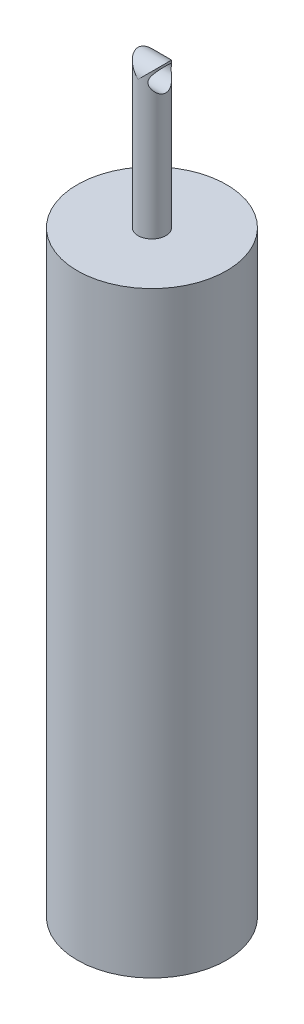
ISO-10303-21;
HEADER;
FILE_DESCRIPTION(('STEP AP214'),'2;1');
FILE_NAME('part.step','',(''),(''),'','','');
FILE_SCHEMA(('AUTOMOTIVE_DESIGN { 1 0 10303 214 1 1 1 1 }'));
ENDSEC;
DATA;
#1=APPLICATION_CONTEXT('core data for automotive mechanical design processes');
#2=APPLICATION_PROTOCOL_DEFINITION('international standard','automotive_design',2000,#1);
#3=PRODUCT_CONTEXT('',#1,'mechanical');
#4=PRODUCT('Part','Part','',(#3));
#5=PRODUCT_RELATED_PRODUCT_CATEGORY('part','',(#4));
#6=PRODUCT_DEFINITION_FORMATION('','',#4);
#7=PRODUCT_DEFINITION_CONTEXT('part definition',#1,'design');
#8=PRODUCT_DEFINITION('design','',#6,#7);
#9=PRODUCT_DEFINITION_SHAPE('','',#8);
#10=(LENGTH_UNIT() NAMED_UNIT(*) SI_UNIT(.MILLI.,.METRE.));
#11=(NAMED_UNIT(*) PLANE_ANGLE_UNIT() SI_UNIT($,.RADIAN.));
#12=(NAMED_UNIT(*) SI_UNIT($,.STERADIAN.) SOLID_ANGLE_UNIT());
#13=UNCERTAINTY_MEASURE_WITH_UNIT(LENGTH_MEASURE(1.E-05),#10,'distance_accuracy_value','');
#14=(GEOMETRIC_REPRESENTATION_CONTEXT(3) GLOBAL_UNCERTAINTY_ASSIGNED_CONTEXT((#13)) GLOBAL_UNIT_ASSIGNED_CONTEXT((#10,
#11,#12)) REPRESENTATION_CONTEXT('',''));
#15=CARTESIAN_POINT('',(0.,0.,0.));
#16=DIRECTION('',(0.,0.,1.));
#17=DIRECTION('',(1.,0.,0.));
#18=AXIS2_PLACEMENT_3D('',#15,#16,#17);
#19=CARTESIAN_POINT('',(0.,254.,0.));
#20=DIRECTION('',(0.,-1.,0.));
#21=DIRECTION('',(0.,0.,-1.));
#22=AXIS2_PLACEMENT_3D('',#19,#20,#21);
#23=CYLINDRICAL_SURFACE('',#22,4.73075);
#24=CARTESIAN_POINT('',(-2.57468813645456,249.26925,-3.96875000000002));
#25=CARTESIAN_POINT('',(-2.57468971332988,249.338601991821,-3.96874942252867));
#26=CARTESIAN_POINT('',(-2.57750730844369,249.407970058366,-3.96692601158753));
#27=CARTESIAN_POINT('',(-2.58861018303855,249.546094547328,-3.95968816621984));
#28=CARTESIAN_POINT('',(-2.59689877167569,249.614850574026,-3.95427155842138));
#29=CARTESIAN_POINT('',(-2.62942371788314,249.819668547789,-3.93278997364381));
#30=CARTESIAN_POINT('',(-2.66131672407075,249.954010545549,-3.91149402252363));
#31=CARTESIAN_POINT('',(-2.75570115172025,250.266925791372,-3.84583712088784));
#32=CARTESIAN_POINT('',(-2.82530243131442,250.442014362949,-3.79568866945637));
#33=CARTESIAN_POINT('',(-2.98035012531049,250.777814814886,-3.67521360901825));
#34=CARTESIAN_POINT('',(-3.06584919847753,250.938476205615,-3.60481950319501));
#35=CARTESIAN_POINT('',(-3.21978521105146,251.204790217722,-3.46708048205793));
#36=CARTESIAN_POINT('',(-3.28663430019577,251.313624601264,-3.40399800638961));
#37=CARTESIAN_POINT('',(-3.42167551477278,251.524334036358,-3.268225138155));
#38=CARTESIAN_POINT('',(-3.48986822354122,251.62620597538,-3.19553049057661));
#39=CARTESIAN_POINT('',(-3.62554279322456,251.8227927752,-3.0407270661403));
#40=CARTESIAN_POINT('',(-3.69302540682989,251.917516050907,-2.95862965362111));
#41=CARTESIAN_POINT('',(-3.82569960997007,252.099592337657,-2.78495427775517));
#42=CARTESIAN_POINT('',(-3.89089095391635,252.186944560034,-2.69337530225777));
#43=CARTESIAN_POINT('',(-4.05349649647098,252.401199638881,-2.44578610524942));
#44=CARTESIAN_POINT('',(-4.14812701200517,252.522308344019,-2.28277565363191));
#45=CARTESIAN_POINT('',(-4.32164710374794,252.740847607605,-1.93420300412105));
#46=CARTESIAN_POINT('',(-4.40056226908315,252.838316715487,-1.74867827217238));
#47=CARTESIAN_POINT('',(-4.52458749478744,252.990059629473,-1.3918615367656));
#48=CARTESIAN_POINT('',(-4.57319506489267,253.04890526409,-1.22374738539483));
#49=CARTESIAN_POINT('',(-4.65211877327305,253.144027399935,-0.877101709358009));
#50=CARTESIAN_POINT('',(-4.68244552296855,253.18031699459,-0.698576294229406));
#51=CARTESIAN_POINT('',(-4.72241952763671,253.228088382441,-0.335104521582716));
#52=CARTESIAN_POINT('',(-4.73197750858056,253.23946308126,-0.150133903620591));
#53=CARTESIAN_POINT('',(-4.7292688074294,253.236234525711,0.219418813555285));
#54=CARTESIAN_POINT('',(-4.71700302474351,253.221632341911,0.404000928466296));
#55=CARTESIAN_POINT('',(-4.67335567862697,253.169431742792,0.754143049894994));
#56=CARTESIAN_POINT('',(-4.64335965621403,253.133499390267,0.920134230873132));
#57=CARTESIAN_POINT('',(-4.56759452754371,253.042120549594,1.24280480698384));
#58=CARTESIAN_POINT('',(-4.52182308957217,252.986671176671,1.39948282155069));
#59=CARTESIAN_POINT('',(-4.41288381129009,252.85339860655,1.71358251663824));
#60=CARTESIAN_POINT('',(-4.34858225732612,252.774093473863,1.86997325887046));
#61=CARTESIAN_POINT('',(-4.2083268142693,252.598484143054,2.16726458994668));
#62=CARTESIAN_POINT('',(-4.13236290272484,252.502165312798,2.30815167468178));
#63=CARTESIAN_POINT('',(-3.99308695696241,252.321806235257,2.53938733554131));
#64=CARTESIAN_POINT('',(-3.9315645815349,252.24100578847,2.6333990241937));
#65=CARTESIAN_POINT('',(-3.80552439042022,252.072134439307,2.81246513959544));
#66=CARTESIAN_POINT('',(-3.74100645082973,251.98406323608,2.89751919536039));
#67=CARTESIAN_POINT('',(-3.61032330340906,251.800956866428,3.05881635104315));
#68=CARTESIAN_POINT('',(-3.54415513342796,251.705908477425,3.13504197691417));
#69=CARTESIAN_POINT('',(-3.41191367327333,251.509216077582,3.2784663472193));
#70=CARTESIAN_POINT('',(-3.34584035808783,251.407574374489,3.34566822507068));
#71=CARTESIAN_POINT('',(-3.23231050629412,251.224388926984,3.45495234870609));
#72=CARTESIAN_POINT('',(-3.18440415243179,251.144331651843,3.49906966478655));
#73=CARTESIAN_POINT('',(-3.09070679702214,250.980383821661,3.58210007111592));
#74=CARTESIAN_POINT('',(-3.04491528949593,250.89649419317,3.62101441044818));
#75=CARTESIAN_POINT('',(-2.95676420764234,250.724874733139,3.69334307909613));
#76=CARTESIAN_POINT('',(-2.91439732260263,250.637153732741,3.72676929054645));
#77=CARTESIAN_POINT('',(-2.83456369118886,250.457608525781,3.78784510516929));
#78=CARTESIAN_POINT('',(-2.79709443202994,250.365786456026,3.81549767496191));
#79=CARTESIAN_POINT('',(-2.71816820067166,250.148264583032,3.87228713877423));
#80=CARTESIAN_POINT('',(-2.67918460623703,250.021018552802,3.89913832994347));
#81=CARTESIAN_POINT('',(-2.61814368106643,249.760707713928,3.94039577931789));
#82=CARTESIAN_POINT('',(-2.59604535032594,249.627657834519,3.95483219327597));
#83=CARTESIAN_POINT('',(-2.57268925163198,249.357766157556,3.97007572412585));
#84=CARTESIAN_POINT('',(-2.5715977075302,249.220902691219,3.97077413502207));
#85=CARTESIAN_POINT('',(-2.59093195265003,248.949308380201,3.95817722511463));
#86=CARTESIAN_POINT('',(-2.61138555676878,248.814580520795,3.94486381499715));
#87=CARTESIAN_POINT('',(-2.6767509535227,248.520062808166,3.90087649847682));
#88=CARTESIAN_POINT('',(-2.72629147281271,248.361851154493,3.86685017734675));
#89=CARTESIAN_POINT('',(-2.84251097363808,248.056392736104,3.78222958950236));
#90=CARTESIAN_POINT('',(-2.90924742108079,247.909184914587,3.73157961086452));
#91=CARTESIAN_POINT('',(-3.03766701431327,247.654359084599,3.62739565117228));
#92=CARTESIAN_POINT('',(-3.09764529607708,247.544752887175,3.57651364227212));
#93=CARTESIAN_POINT('',(-3.22093516159029,247.332001218929,3.46589526925913));
#94=CARTESIAN_POINT('',(-3.2842485486437,247.228859310761,3.40615408260165));
#95=CARTESIAN_POINT('',(-3.41217318588725,247.028754329536,3.27800018224335));
#96=CARTESIAN_POINT('',(-3.47678593622256,246.931799010015,3.2095768962282));
#97=CARTESIAN_POINT('',(-3.60556613667967,246.744228893895,3.06419958740264));
#98=CARTESIAN_POINT('',(-3.66973367370176,246.653612826689,2.98724728214442));
#99=CARTESIAN_POINT('',(-3.79813673076094,246.476281479666,2.82230552576996));
#100=CARTESIAN_POINT('',(-3.86231421417695,246.389770493945,2.73405033897706));
#101=CARTESIAN_POINT('',(-3.98722410662841,246.224273763369,2.54844248198927));
#102=CARTESIAN_POINT('',(-4.047955867987,246.145289431381,2.45108811050593));
#103=CARTESIAN_POINT('',(-4.16434188249129,245.995886255273,2.24765087824644));
#104=CARTESIAN_POINT('',(-4.22000974949865,245.925444264814,2.14159297199866));
#105=CARTESIAN_POINT('',(-4.3249265080885,245.793975177598,1.92092429908769));
#106=CARTESIAN_POINT('',(-4.37417907934508,245.73294268004,1.80631849517012));
#107=CARTESIAN_POINT('',(-4.48036596438693,245.602292597899,1.52817610657993));
#108=CARTESIAN_POINT('',(-4.53414094904922,245.536910295886,1.36133912550171));
#109=CARTESIAN_POINT('',(-4.60135213987214,245.455636717494,1.10251882689557));
#110=CARTESIAN_POINT('',(-4.62151654297543,245.431342483367,1.01480043205114));
#111=CARTESIAN_POINT('',(-4.65699984242304,245.388686792969,0.83698680006041));
#112=CARTESIAN_POINT('',(-4.67232097323535,245.37032260076,0.746892679813501));
#113=CARTESIAN_POINT('',(-4.69786976563128,245.339742148144,0.564407471082905));
#114=CARTESIAN_POINT('',(-4.70806744853771,245.327562068365,0.472006109696346));
#115=CARTESIAN_POINT('',(-4.72300603097102,245.309731000042,0.286172811117834));
#116=CARTESIAN_POINT('',(-4.72774917195934,245.304077329566,0.192741313191665));
#117=CARTESIAN_POINT('',(-4.73167209694337,245.299400632501,0.00558041267817192));
#118=CARTESIAN_POINT('',(-4.73085133622483,245.300378255127,-0.0881490181793445));
#119=CARTESIAN_POINT('',(-4.72367446612404,245.308936279298,-0.275064556600235));
#120=CARTESIAN_POINT('',(-4.71731863037996,245.316516354438,-0.368250690793372));
#121=CARTESIAN_POINT('',(-4.69158924111413,245.34724497932,-0.630956035453955));
#122=CARTESIAN_POINT('',(-4.66577114825941,245.37811568523,-0.799035338260033));
#123=CARTESIAN_POINT('',(-4.59770681543588,245.459998091868,-1.1265706175386));
#124=CARTESIAN_POINT('',(-4.55545793527298,245.511013029507,-1.28602520344877));
#125=CARTESIAN_POINT('',(-4.45406854022414,245.634551396785,-1.60335538048113));
#126=CARTESIAN_POINT('',(-4.3940237296573,245.708237564288,-1.76048388316226));
#127=CARTESIAN_POINT('',(-4.26182767378266,245.872699103069,-2.06001592499108));
#128=CARTESIAN_POINT('',(-4.18966822414915,245.96348606053,-2.20240937886165));
#129=CARTESIAN_POINT('',(-4.05656531879159,246.134163941833,-2.43668647911146));
#130=CARTESIAN_POINT('',(-3.99755443247883,246.21079102411,-2.53210294973319));
#131=CARTESIAN_POINT('',(-3.87614443774748,246.371279013279,-2.71430995348121));
#132=CARTESIAN_POINT('',(-3.81374521085058,246.45514017318,-2.80110018467762));
#133=CARTESIAN_POINT('',(-3.68678178873644,246.629752827064,-2.96622823046813));
#134=CARTESIAN_POINT('',(-3.62221279147416,246.720520255008,-3.04454542305183));
#135=CARTESIAN_POINT('',(-3.49251904924532,246.908465190894,-3.19248697176139));
#136=CARTESIAN_POINT('',(-3.427394461141,247.005640938504,-3.2621137000366));
#137=CARTESIAN_POINT('',(-3.30973319356822,247.188552241747,-3.38102996837496));
#138=CARTESIAN_POINT('',(-3.25701519075626,247.273254163814,-3.43173518303416));
#139=CARTESIAN_POINT('',(-3.15345780621545,247.447119588406,-3.52713097515275));
#140=CARTESIAN_POINT('',(-3.10261872652661,247.536283802877,-3.57182058861878));
#141=CARTESIAN_POINT('',(-3.00436184656121,247.719056783585,-3.65485019162542));
#142=CARTESIAN_POINT('',(-2.95693649788117,247.812654934224,-3.69320444944226));
#143=CARTESIAN_POINT('',(-2.86724224640467,248.004635398903,-3.7632641658387));
#144=CARTESIAN_POINT('',(-2.8249699531256,248.103014507025,-3.79497400613471));
#145=CARTESIAN_POINT('',(-2.73775182197481,248.331109097147,-3.85853886180135));
#146=CARTESIAN_POINT('',(-2.69499439950884,248.462294891528,-3.88826609549779));
#147=CARTESIAN_POINT('',(-2.62713620861666,248.731214367651,-3.93445129982635));
#148=CARTESIAN_POINT('',(-2.6019665795642,248.868920232994,-3.95096105763828));
#149=CARTESIAN_POINT('',(-2.58352187490537,249.051398409565,-3.96300686982782));
#150=CARTESIAN_POINT('',(-2.58021904740938,249.094863348761,-3.96515688608245));
#151=CARTESIAN_POINT('',(-2.57580142975833,249.181966711401,-3.96802879751452));
#152=CARTESIAN_POINT('',(-2.57468714409011,249.22560517252,-3.96875036341622));
#153=CARTESIAN_POINT('',(-2.57468813645456,249.26925,-3.96875000000002));
#154=B_SPLINE_CURVE_WITH_KNOTS('',3,(#24,#25,#26,#27,#28,#29,#30,#31,#32,#33,#34,#35,#36,#37,
#38,#39,#40,#41,#42,#43,#44,#45,#46,#47,#48,#49,#50,#51,#52,#53,#54,#55,#56,#57,#58,#59,#60,#61,
#62,#63,#64,#65,#66,#67,#68,#69,#70,#71,#72,#73,#74,#75,#76,#77,#78,#79,#80,#81,#82,#83,#84,#85,
#86,#87,#88,#89,#90,#91,#92,#93,#94,#95,#96,#97,#98,#99,#100,#101,#102,#103,#104,#105,#106,#107,
#108,#109,#110,#111,#112,#113,#114,#115,#116,#117,#118,#119,#120,#121,#122,#123,#124,#125,#126,
#127,#128,#129,#130,#131,#132,#133,#134,#135,#136,#137,#138,#139,#140,#141,#142,#143,#144,#145,
#146,#147,#148,#149,#150,#151,#152,#153),.UNSPECIFIED.,.T.,.F.,(4,2,2,2,2,2,2,2,2,2,2,2,2,2,2,2,
2,2,2,2,2,2,2,2,2,2,2,2,2,2,2,2,2,2,2,2,2,2,2,2,2,2,2,2,2,2,2,2,2,2,2,2,2,2,2,2,2,2,2,2,2,2,2,2,
4),(0.,0.20800108943598,0.416128104735437,0.833179099702599,1.41493363412349,1.99865061532348,
2.42553418063593,2.85260735075549,3.27916969430399,3.70577762014531,4.37524812967875,
5.04361947087045,5.59519888597142,6.14645781811188,6.70008167370932,7.25368271368136,
7.76886837787228,8.28413022270259,8.84242932267759,9.4012109302121,9.81588202140298,
10.2305702796358,10.6460657858591,11.0614166397448,11.3708242817284,11.6801575100528,
11.988811920103,12.2973073445197,12.7031613501032,13.108026720584,13.5160944299719,
13.9246896032877,14.4295967582683,14.9362136207059,15.3404356938636,15.7448786209125,
16.1498188570735,16.5546776950552,16.9719286736185,17.3892578228961,17.8054296365709,
18.2213616820044,18.77995285923,19.0593547017259,19.3386274520131,19.6195158066742,
19.9002886932239,20.1810890682541,20.4618755621108,20.9778472245069,21.4939018304978,
22.0428170725805,22.5921055640091,22.9991916821128,23.4062920437584,23.8143619307934,
24.22232018633,24.5578194421924,24.8933723975926,25.2281590119861,25.5627241488552,
25.9847242162102,26.4050626471401,26.5359324249045,26.6668323662852),.UNSPECIFIED.);
#155=CARTESIAN_POINT('',(-2.57468813645456,249.26925,-3.96875000000002));
#156=VERTEX_POINT('',#155);
#157=EDGE_CURVE('E91',#156,#156,#154,.T.);
#158=ORIENTED_EDGE('',*,*,#157,.T.);
#159=EDGE_LOOP('',(#158));
#160=FACE_BOUND('',#159,.T.);
#161=CARTESIAN_POINT('',(2.57468813645456,249.26925,-3.96875000000002));
#162=CARTESIAN_POINT('',(2.57468971332988,249.199898008179,-3.96874942252867));
#163=CARTESIAN_POINT('',(2.57750730844369,249.130529941634,-3.96692601158753));
#164=CARTESIAN_POINT('',(2.58861018303855,248.992405452672,-3.95968816621984));
#165=CARTESIAN_POINT('',(2.59689877167569,248.923649425974,-3.95427155842138));
#166=CARTESIAN_POINT('',(2.62942371788314,248.718831452211,-3.93278997364381));
#167=CARTESIAN_POINT('',(2.66131672407075,248.584489454451,-3.91149402252363));
#168=CARTESIAN_POINT('',(2.75570115172024,248.271574208628,-3.84583712088785));
#169=CARTESIAN_POINT('',(2.82530243131442,248.096485637051,-3.79568866945637));
#170=CARTESIAN_POINT('',(2.98035012531047,247.760685185114,-3.67521360901826));
#171=CARTESIAN_POINT('',(3.06584919847751,247.600023794385,-3.60481950319502));
#172=CARTESIAN_POINT('',(3.21978521105144,247.333709782278,-3.46708048205795));
#173=CARTESIAN_POINT('',(3.28663430019575,247.224875398736,-3.40399800638963));
#174=CARTESIAN_POINT('',(3.42167551477275,247.014165963642,-3.26822513815503));
#175=CARTESIAN_POINT('',(3.48986822354119,246.91229402462,-3.19553049057664));
#176=CARTESIAN_POINT('',(3.62554279322454,246.7157072248,-3.04072706614032));
#177=CARTESIAN_POINT('',(3.69302540682989,246.620983949093,-2.9586296536211));
#178=CARTESIAN_POINT('',(3.82569960997007,246.438907662343,-2.78495427775516));
#179=CARTESIAN_POINT('',(3.89089095391634,246.351555439966,-2.69337530225779));
#180=CARTESIAN_POINT('',(4.05349649647095,246.137300361119,-2.44578610524947));
#181=CARTESIAN_POINT('',(4.14812701200515,246.016191655981,-2.28277565363193));
#182=CARTESIAN_POINT('',(4.32164710374794,245.797652392395,-1.93420300412106));
#183=CARTESIAN_POINT('',(4.40056226908315,245.700183284513,-1.74867827217239));
#184=CARTESIAN_POINT('',(4.52458749478743,245.548440370527,-1.39186153676562));
#185=CARTESIAN_POINT('',(4.57319506489267,245.48959473591,-1.22374738539484));
#186=CARTESIAN_POINT('',(4.65211877327304,245.394472600065,-0.877101709358024));
#187=CARTESIAN_POINT('',(4.68244552296854,245.35818300541,-0.698576294229423));
#188=CARTESIAN_POINT('',(4.72241952763671,245.310411617559,-0.33510452158274));
#189=CARTESIAN_POINT('',(4.73197750858056,245.29903691874,-0.150133903620619));
#190=CARTESIAN_POINT('',(4.7292688074294,245.302265474289,0.219418813555251));
#191=CARTESIAN_POINT('',(4.71700302474351,245.316867658089,0.40400092846626));
#192=CARTESIAN_POINT('',(4.67335567862698,245.369068257208,0.754143049894956));
#193=CARTESIAN_POINT('',(4.64335965621404,245.405000609733,0.920134230873095));
#194=CARTESIAN_POINT('',(4.56759452754372,245.496379450406,1.2428048069838));
#195=CARTESIAN_POINT('',(4.52182308957218,245.551828823329,1.39948282155065));
#196=CARTESIAN_POINT('',(4.41288381129009,245.68510139345,1.71358251663822));
#197=CARTESIAN_POINT('',(4.34858225732612,245.764406526137,1.86997325887045));
#198=CARTESIAN_POINT('',(4.20832681426931,245.940015856946,2.16726458994666));
#199=CARTESIAN_POINT('',(4.13236290272485,246.036334687202,2.30815167468175));
#200=CARTESIAN_POINT('',(3.99308695696244,246.216693764743,2.53938733554127));
#201=CARTESIAN_POINT('',(3.93156458153493,246.29749421153,2.63339902419365));
#202=CARTESIAN_POINT('',(3.80552439042025,246.466365560693,2.81246513959539));
#203=CARTESIAN_POINT('',(3.74100645082976,246.55443676392,2.89751919536034));
#204=CARTESIAN_POINT('',(3.6103233034091,246.737543133572,3.0588163510431));
#205=CARTESIAN_POINT('',(3.54415513342799,246.832591522575,3.13504197691412));
#206=CARTESIAN_POINT('',(3.41191367327336,247.029283922418,3.27846634721927));
#207=CARTESIAN_POINT('',(3.34584035808786,247.130925625511,3.34566822507065));
#208=CARTESIAN_POINT('',(3.23231050629415,247.314111073016,3.45495234870606));
#209=CARTESIAN_POINT('',(3.18440415243183,247.394168348157,3.49906966478651));
#210=CARTESIAN_POINT('',(3.09070679702219,247.558116178339,3.58210007111588));
#211=CARTESIAN_POINT('',(3.04491528949598,247.64200580683,3.62101441044814));
#212=CARTESIAN_POINT('',(2.95676420764238,247.813625266861,3.6933430790961));
#213=CARTESIAN_POINT('',(2.91439732260266,247.901346267259,3.72676929054643));
#214=CARTESIAN_POINT('',(2.83456369118888,248.080891474219,3.78784510516927));
#215=CARTESIAN_POINT('',(2.79709443202996,248.172713543974,3.81549767496189));
#216=CARTESIAN_POINT('',(2.71816820067168,248.390235416968,3.87228713877421));
#217=CARTESIAN_POINT('',(2.67918460623704,248.517481447198,3.89913832994346));
#218=CARTESIAN_POINT('',(2.61814368106644,248.777792286071,3.94039577931789));
#219=CARTESIAN_POINT('',(2.59604535032594,248.910842165481,3.95483219327597));
#220=CARTESIAN_POINT('',(2.57268925163198,249.180733842444,3.97007572412585));
#221=CARTESIAN_POINT('',(2.5715977075302,249.317597308781,3.97077413502207));
#222=CARTESIAN_POINT('',(2.59093195265004,249.589191619799,3.95817722511463));
#223=CARTESIAN_POINT('',(2.61138555676879,249.723919479205,3.94486381499714));
#224=CARTESIAN_POINT('',(2.6767509535227,250.018437191834,3.90087649847681));
#225=CARTESIAN_POINT('',(2.72629147281271,250.176648845507,3.86685017734675));
#226=CARTESIAN_POINT('',(2.84251097363807,250.482107263896,3.78222958950236));
#227=CARTESIAN_POINT('',(2.90924742108078,250.629315085413,3.73157961086453));
#228=CARTESIAN_POINT('',(3.03766701431325,250.884140915401,3.6273956511723));
#229=CARTESIAN_POINT('',(3.09764529607707,250.993747112825,3.57651364227213));
#230=CARTESIAN_POINT('',(3.22093516159027,251.20649878107,3.46589526925915));
#231=CARTESIAN_POINT('',(3.28424854864368,251.309640689239,3.40615408260167));
#232=CARTESIAN_POINT('',(3.41217318588721,251.509745670464,3.27800018224338));
#233=CARTESIAN_POINT('',(3.47678593622253,251.606700989985,3.20957689622824));
#234=CARTESIAN_POINT('',(3.60556613667963,251.794271106105,3.06419958740269));
#235=CARTESIAN_POINT('',(3.66973367370173,251.884887173311,2.98724728214446));
#236=CARTESIAN_POINT('',(3.79813673076089,252.062218520334,2.82230552577002));
#237=CARTESIAN_POINT('',(3.86231421417689,252.148729506055,2.73405033897714));
#238=CARTESIAN_POINT('',(3.98722410662836,252.314226236631,2.54844248198935));
#239=CARTESIAN_POINT('',(4.04795586798696,252.393210568619,2.45108811050599));
#240=CARTESIAN_POINT('',(4.16434188249125,252.542613744726,2.24765087824651));
#241=CARTESIAN_POINT('',(4.22000974949861,252.613055735186,2.14159297199874));
#242=CARTESIAN_POINT('',(4.32492650808845,252.744524822402,1.92092429908779));
#243=CARTESIAN_POINT('',(4.37417907934504,252.80555731996,1.80631849517022));
#244=CARTESIAN_POINT('',(4.4803659643869,252.936207402101,1.52817610658003));
#245=CARTESIAN_POINT('',(4.53414094904919,253.001589704114,1.3613391255018));
#246=CARTESIAN_POINT('',(4.60135213987212,253.082863282505,1.10251882689568));
#247=CARTESIAN_POINT('',(4.62151654297541,253.107157516633,1.01480043205125));
#248=CARTESIAN_POINT('',(4.65699984242302,253.149813207031,0.83698680006052));
#249=CARTESIAN_POINT('',(4.67232097323533,253.16817739924,0.746892679813604));
#250=CARTESIAN_POINT('',(4.69786976563127,253.198757851856,0.564407471083));
#251=CARTESIAN_POINT('',(4.7080674485377,253.210937931635,0.47200610969644));
#252=CARTESIAN_POINT('',(4.72300603097101,253.228768999958,0.286172811117928));
#253=CARTESIAN_POINT('',(4.72774917195933,253.234422670434,0.19274131319176));
#254=CARTESIAN_POINT('',(4.73167209694337,253.239099367499,0.00558041267826439));
#255=CARTESIAN_POINT('',(4.73085133622483,253.238121744873,-0.0881490181792547));
#256=CARTESIAN_POINT('',(4.72367446612405,253.229563720702,-0.275064556600147));
#257=CARTESIAN_POINT('',(4.71731863037997,253.221983645562,-0.368250690793283));
#258=CARTESIAN_POINT('',(4.69158924111414,253.19125502068,-0.630956035453869));
#259=CARTESIAN_POINT('',(4.66577114825942,253.16038431477,-0.799035338259954));
#260=CARTESIAN_POINT('',(4.5977068154359,253.078501908132,-1.12657061753853));
#261=CARTESIAN_POINT('',(4.55545793527301,253.027486970493,-1.2860252034487));
#262=CARTESIAN_POINT('',(4.45406854022417,252.903948603215,-1.60335538048106));
#263=CARTESIAN_POINT('',(4.39402372965732,252.830262435712,-1.76048388316221));
#264=CARTESIAN_POINT('',(4.26182767378268,252.665800896931,-2.06001592499104));
#265=CARTESIAN_POINT('',(4.18966822414918,252.57501393947,-2.2024093788616));
#266=CARTESIAN_POINT('',(4.05656531879162,252.404336058167,-2.4366864791114));
#267=CARTESIAN_POINT('',(3.99755443247887,252.32770897589,-2.53210294973314));
#268=CARTESIAN_POINT('',(3.87614443774753,252.167220986721,-2.71430995348114));
#269=CARTESIAN_POINT('',(3.81374521085064,252.08335982682,-2.80110018467754));
#270=CARTESIAN_POINT('',(3.68678178873651,251.908747172936,-2.96622823046805));
#271=CARTESIAN_POINT('',(3.62221279147421,251.817979744992,-3.04454542305176));
#272=CARTESIAN_POINT('',(3.49251904924537,251.630034809106,-3.19248697176134));
#273=CARTESIAN_POINT('',(3.42739446114104,251.532859061496,-3.26211370003655));
#274=CARTESIAN_POINT('',(3.30973319356826,251.349947758253,-3.38102996837493));
#275=CARTESIAN_POINT('',(3.25701519075629,251.265245836186,-3.43173518303413));
#276=CARTESIAN_POINT('',(3.15345780621547,251.091380411594,-3.52713097515273));
#277=CARTESIAN_POINT('',(3.10261872652663,251.002216197123,-3.57182058861877));
#278=CARTESIAN_POINT('',(3.00436184656122,250.819443216415,-3.65485019162541));
#279=CARTESIAN_POINT('',(2.95693649788117,250.725845065776,-3.69320444944226));
#280=CARTESIAN_POINT('',(2.86724224640467,250.533864601097,-3.7632641658387));
#281=CARTESIAN_POINT('',(2.8249699531256,250.435485492975,-3.79497400613471));
#282=CARTESIAN_POINT('',(2.7377518219748,250.207390902853,-3.85853886180136));
#283=CARTESIAN_POINT('',(2.69499439950883,250.076205108472,-3.8882660954978));
#284=CARTESIAN_POINT('',(2.62713620861664,249.807285632349,-3.93445129982636));
#285=CARTESIAN_POINT('',(2.6019665795642,249.669579767006,-3.95096105763828));
#286=CARTESIAN_POINT('',(2.58352187490537,249.487101590435,-3.96300686982783));
#287=CARTESIAN_POINT('',(2.58021904740938,249.443636651239,-3.96515688608246));
#288=CARTESIAN_POINT('',(2.57580142975832,249.356533288599,-3.96802879751452));
#289=CARTESIAN_POINT('',(2.57468714409011,249.31289482748,-3.96875036341622));
#290=CARTESIAN_POINT('',(2.57468813645456,249.26925,-3.96875000000002));
#291=B_SPLINE_CURVE_WITH_KNOTS('',3,(#161,#162,#163,#164,#165,#166,#167,#168,#169,#170,#171,
#172,#173,#174,#175,#176,#177,#178,#179,#180,#181,#182,#183,#184,#185,#186,#187,#188,#189,#190,
#191,#192,#193,#194,#195,#196,#197,#198,#199,#200,#201,#202,#203,#204,#205,#206,#207,#208,#209,
#210,#211,#212,#213,#214,#215,#216,#217,#218,#219,#220,#221,#222,#223,#224,#225,#226,#227,#228,
#229,#230,#231,#232,#233,#234,#235,#236,#237,#238,#239,#240,#241,#242,#243,#244,#245,#246,#247,
#248,#249,#250,#251,#252,#253,#254,#255,#256,#257,#258,#259,#260,#261,#262,#263,#264,#265,#266,
#267,#268,#269,#270,#271,#272,#273,#274,#275,#276,#277,#278,#279,#280,#281,#282,#283,#284,#285,
#286,#287,#288,#289,#290),.UNSPECIFIED.,.T.,.F.,(4,2,2,2,2,2,2,2,2,2,2,2,2,2,2,2,2,2,2,2,2,2,2,
2,2,2,2,2,2,2,2,2,2,2,2,2,2,2,2,2,2,2,2,2,2,2,2,2,2,2,2,2,2,2,2,2,2,2,2,2,2,2,2,2,4),(0.,
0.20800108943598,0.416128104735437,0.833179099702599,1.41493363412345,1.99865061532345,
2.42553418063586,2.85260735075544,3.279169694304,3.70577762014527,4.37524812967869,
5.04361947087044,5.59519888597141,6.14645781811185,6.70008167370928,7.25368271368132,
7.76886837787224,8.28413022270254,8.84242932267759,9.40121093021206,9.81588202140289,
10.2305702796357,10.646065785859,11.0614166397448,11.3708242817282,11.6801575100527,
11.988811920103,12.2973073445196,12.7031613501032,13.1080267205839,13.5160944299719,
13.9246896032877,14.4295967582684,14.9362136207059,15.3404356938636,15.7448786209124,
16.1498188570734,16.5546776950551,16.9719286736184,17.389257822896,17.8054296365708,
18.2213616820043,18.7799528592299,19.0593547017258,19.338627452013,19.619515806674,
19.9002886932238,20.181089068254,20.4618755621108,20.9778472245068,21.4939018304977,
22.0428170725805,22.592105564009,22.9991916821127,23.4062920437583,23.8143619307933,
24.2223201863299,24.5578194421923,24.8933723975926,25.2281590119861,25.5627241488553,
25.9847242162102,26.4050626471401,26.5359324249045,26.6668323662852),.UNSPECIFIED.);
#292=CARTESIAN_POINT('',(2.57468813645456,249.26925,-3.96875000000002));
#293=VERTEX_POINT('',#292);
#294=EDGE_CURVE('E117',#293,#293,#291,.T.);
#295=ORIENTED_EDGE('',*,*,#294,.T.);
#296=EDGE_LOOP('',(#295));
#297=FACE_BOUND('',#296,.T.);
#298=CARTESIAN_POINT('',(0.,203.2,0.));
#299=DIRECTION('',(0.,1.,0.));
#300=DIRECTION('',(0.,0.,1.));
#301=AXIS2_PLACEMENT_3D('',#298,#299,#300);
#302=CIRCLE('',#301,4.73075);
#303=CARTESIAN_POINT('',(0.,203.2,4.73075));
#304=VERTEX_POINT('',#303);
#305=EDGE_CURVE('E12',#304,#304,#302,.T.);
#306=ORIENTED_EDGE('',*,*,#305,.T.);
#307=EDGE_LOOP('',(#306));
#308=FACE_BOUND('',#307,.T.);
#309=CARTESIAN_POINT('',(0.,249.26925,0.));
#310=DIRECTION('',(-0.707106781186547,-0.707106781186547,0.));
#311=DIRECTION('',(0.707106781186547,-0.707106781186547,0.));
#312=AXIS2_PLACEMENT_3D('',#309,#310,#311);
#313=ELLIPSE('',#312,6.69029081019653,4.73075);
#314=CARTESIAN_POINT('',(0.,249.26925,-4.73075));
#315=VERTEX_POINT('',#314);
#316=CARTESIAN_POINT('',(0.,249.26925,4.73075));
#317=VERTEX_POINT('',#316);
#318=EDGE_CURVE('E109',#315,#317,#313,.F.);
#319=ORIENTED_EDGE('',*,*,#318,.F.);
#320=CARTESIAN_POINT('',(0.,249.26925,0.));
#321=DIRECTION('',(0.707106781186547,-0.707106781186547,0.));
#322=DIRECTION('',(-0.707106781186547,-0.707106781186547,0.));
#323=AXIS2_PLACEMENT_3D('',#320,#321,#322);
#324=ELLIPSE('',#323,6.69029081019653,4.73075);
#325=EDGE_CURVE('E112',#317,#315,#324,.F.);
#326=ORIENTED_EDGE('',*,*,#325,.F.);
#327=EDGE_LOOP('',(#319,#326));
#328=FACE_BOUND('',#327,.T.);
#329=ADVANCED_FACE('F87',(#160,#297,#308,#328),#23,.T.);
#330=CARTESIAN_POINT('',(0.,203.2,0.));
#331=DIRECTION('',(0.,-1.,0.));
#332=DIRECTION('',(0.,0.,-1.));
#333=AXIS2_PLACEMENT_3D('',#330,#331,#332);
#334=CYLINDRICAL_SURFACE('',#333,25.4);
#335=CARTESIAN_POINT('',(0.,203.2,0.));
#336=DIRECTION('',(0.,1.,0.));
#337=DIRECTION('',(0.,0.,1.));
#338=AXIS2_PLACEMENT_3D('',#335,#336,#337);
#339=CIRCLE('',#338,25.4);
#340=CARTESIAN_POINT('',(0.,203.2,25.4));
#341=VERTEX_POINT('',#340);
#342=EDGE_CURVE('E102',#341,#341,#339,.T.);
#343=ORIENTED_EDGE('',*,*,#342,.F.);
#344=EDGE_LOOP('',(#343));
#345=FACE_BOUND('',#344,.T.);
#346=CARTESIAN_POINT('',(0.,0.,0.));
#347=DIRECTION('',(0.,1.,0.));
#348=DIRECTION('',(0.,0.,1.));
#349=AXIS2_PLACEMENT_3D('',#346,#347,#348);
#350=CIRCLE('',#349,25.4);
#351=CARTESIAN_POINT('',(0.,0.,25.4));
#352=VERTEX_POINT('',#351);
#353=EDGE_CURVE('E125',#352,#352,#350,.T.);
#354=ORIENTED_EDGE('',*,*,#353,.T.);
#355=EDGE_LOOP('',(#354));
#356=FACE_BOUND('',#355,.T.);
#357=ADVANCED_FACE('F89',(#345,#356),#334,.T.);
#358=CARTESIAN_POINT('',(0.,203.2,0.));
#359=DIRECTION('',(0.,1.,0.));
#360=DIRECTION('',(0.,0.,1.));
#361=AXIS2_PLACEMENT_3D('',#358,#359,#360);
#362=PLANE('',#361);
#363=ORIENTED_EDGE('',*,*,#305,.F.);
#364=EDGE_LOOP('',(#363));
#365=FACE_BOUND('',#364,.T.);
#366=ORIENTED_EDGE('',*,*,#342,.T.);
#367=EDGE_LOOP('',(#366));
#368=FACE_BOUND('',#367,.T.);
#369=ADVANCED_FACE('F144',(#365,#368),#362,.T.);
#370=CARTESIAN_POINT('',(0.,0.,0.));
#371=DIRECTION('',(0.,1.,0.));
#372=DIRECTION('',(0.,0.,1.));
#373=AXIS2_PLACEMENT_3D('',#370,#371,#372);
#374=PLANE('',#373);
#375=ORIENTED_EDGE('',*,*,#353,.F.);
#376=EDGE_LOOP('',(#375));
#377=FACE_BOUND('',#376,.T.);
#378=ADVANCED_FACE('F140',(#377),#374,.F.);
#379=CARTESIAN_POINT('',(-25.4,249.26925,0.));
#380=DIRECTION('',(1.,0.,0.));
#381=DIRECTION('',(0.,0.,-1.));
#382=AXIS2_PLACEMENT_3D('',#379,#380,#381);
#383=CYLINDRICAL_SURFACE('',#382,4.73075000000001);
#384=ORIENTED_EDGE('',*,*,#325,.T.);
#385=ORIENTED_EDGE('',*,*,#318,.T.);
#386=EDGE_LOOP('',(#384,#385));
#387=FACE_BOUND('',#386,.T.);
#388=ADVANCED_FACE('F115',(#387),#383,.T.);
#389=CARTESIAN_POINT('',(-25.4,249.26925,0.));
#390=DIRECTION('',(1.,0.,0.));
#391=DIRECTION('',(0.,0.,-1.));
#392=AXIS2_PLACEMENT_3D('',#389,#390,#391);
#393=CYLINDRICAL_SURFACE('',#392,3.96875000000002);
#394=ORIENTED_EDGE('',*,*,#294,.F.);
#395=EDGE_LOOP('',(#394));
#396=FACE_BOUND('',#395,.T.);
#397=ORIENTED_EDGE('',*,*,#157,.F.);
#398=EDGE_LOOP('',(#397));
#399=FACE_BOUND('',#398,.T.);
#400=ADVANCED_FACE('F133',(#396,#399),#393,.F.);
#401=CLOSED_SHELL('',(#329,#357,#369,#378,#388,#400));
#402=MANIFOLD_SOLID_BREP('B2',#401);
#403=ADVANCED_BREP_SHAPE_REPRESENTATION('',(#18,#402),#14);
#404=SHAPE_DEFINITION_REPRESENTATION(#9,#403);
ENDSEC;
END-ISO-10303-21;
